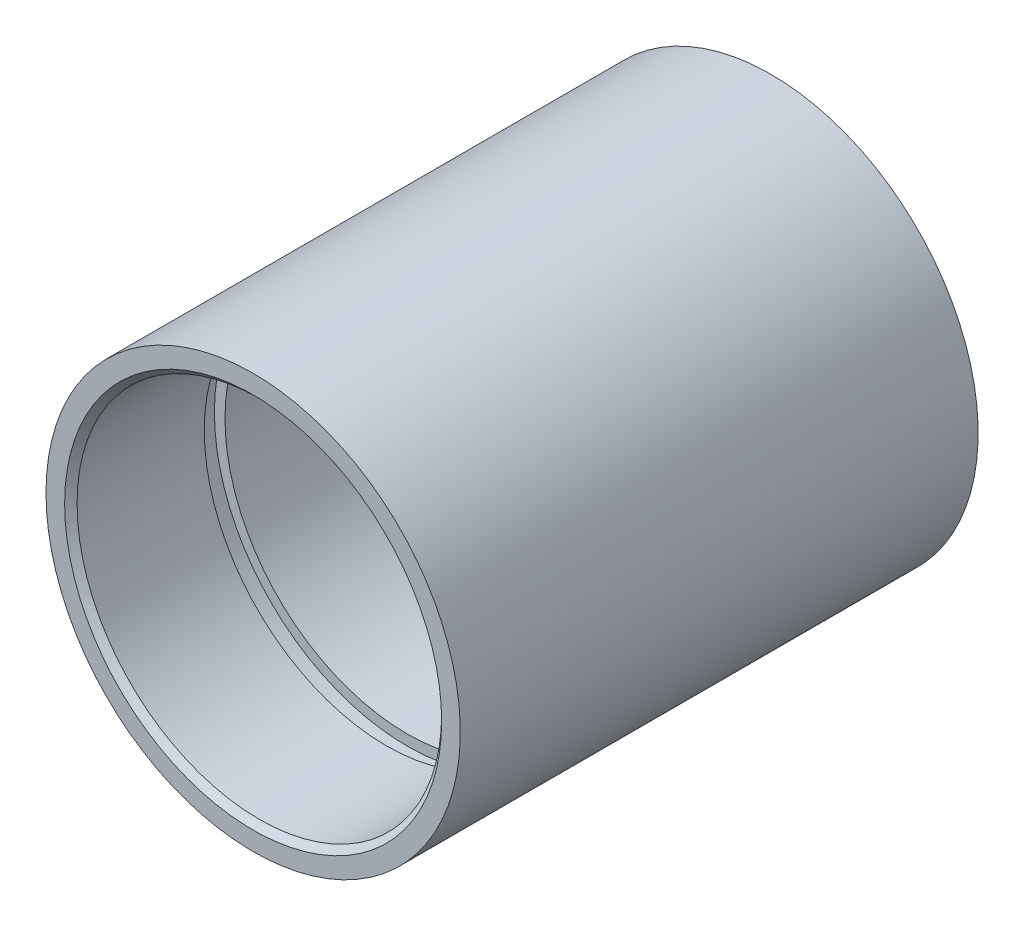
ISO-10303-21;
HEADER;
FILE_DESCRIPTION(('STEP AP214'),'2;1');
FILE_NAME('part.step','',(''),(''),'','','');
FILE_SCHEMA(('AUTOMOTIVE_DESIGN { 1 0 10303 214 1 1 1 1 }'));
ENDSEC;
DATA;
#1=APPLICATION_CONTEXT('core data for automotive mechanical design processes');
#2=APPLICATION_PROTOCOL_DEFINITION('international standard','automotive_design',2000,#1);
#3=PRODUCT_CONTEXT('',#1,'mechanical');
#4=PRODUCT('Part','Part','',(#3));
#5=PRODUCT_RELATED_PRODUCT_CATEGORY('part','',(#4));
#6=PRODUCT_DEFINITION_FORMATION('','',#4);
#7=PRODUCT_DEFINITION_CONTEXT('part definition',#1,'design');
#8=PRODUCT_DEFINITION('design','',#6,#7);
#9=PRODUCT_DEFINITION_SHAPE('','',#8);
#10=(LENGTH_UNIT() NAMED_UNIT(*) SI_UNIT(.MILLI.,.METRE.));
#11=(NAMED_UNIT(*) PLANE_ANGLE_UNIT() SI_UNIT($,.RADIAN.));
#12=(NAMED_UNIT(*) SI_UNIT($,.STERADIAN.) SOLID_ANGLE_UNIT());
#13=UNCERTAINTY_MEASURE_WITH_UNIT(LENGTH_MEASURE(1.E-05),#10,'distance_accuracy_value','');
#14=(GEOMETRIC_REPRESENTATION_CONTEXT(3) GLOBAL_UNCERTAINTY_ASSIGNED_CONTEXT((#13)) GLOBAL_UNIT_ASSIGNED_CONTEXT((#10,
#11,#12)) REPRESENTATION_CONTEXT('',''));
#15=CARTESIAN_POINT('',(0.,0.,0.));
#16=DIRECTION('',(0.,0.,1.));
#17=DIRECTION('',(1.,0.,0.));
#18=AXIS2_PLACEMENT_3D('',#15,#16,#17);
#19=CARTESIAN_POINT('',(0.,0.,22.3012));
#20=DIRECTION('',(0.,0.,1.));
#21=DIRECTION('',(1.,0.,0.));
#22=AXIS2_PLACEMENT_3D('',#19,#20,#21);
#23=PLANE('',#22);
#24=CARTESIAN_POINT('',(0.,0.,22.3012));
#25=DIRECTION('',(0.,0.,1.));
#26=DIRECTION('',(1.,0.,0.));
#27=AXIS2_PLACEMENT_3D('',#24,#25,#26);
#28=CIRCLE('',#27,11.176);
#29=CARTESIAN_POINT('',(11.176,0.,22.3012));
#30=VERTEX_POINT('',#29);
#31=EDGE_CURVE('E28',#30,#30,#28,.T.);
#32=ORIENTED_EDGE('',*,*,#31,.F.);
#33=EDGE_LOOP('',(#32));
#34=FACE_BOUND('',#33,.T.);
#35=CARTESIAN_POINT('',(0.,0.,22.3012));
#36=DIRECTION('',(0.,0.,1.));
#37=DIRECTION('',(1.,0.,0.));
#38=AXIS2_PLACEMENT_3D('',#35,#36,#37);
#39=CIRCLE('',#38,11.8237);
#40=CARTESIAN_POINT('',(-11.8237,0.,22.3012));
#41=VERTEX_POINT('',#40);
#42=EDGE_CURVE('E129',#41,#41,#39,.T.);
#43=ORIENTED_EDGE('',*,*,#42,.T.);
#44=EDGE_LOOP('',(#43));
#45=FACE_BOUND('',#44,.T.);
#46=ADVANCED_FACE('F17',(#34,#45),#23,.T.);
#47=CARTESIAN_POINT('',(0.,0.,23.5712));
#48=DIRECTION('',(0.,0.,1.));
#49=DIRECTION('',(1.,0.,0.));
#50=AXIS2_PLACEMENT_3D('',#47,#48,#49);
#51=PLANE('',#50);
#52=CARTESIAN_POINT('',(0.,0.,23.5712));
#53=DIRECTION('',(0.,0.,1.));
#54=DIRECTION('',(1.,0.,0.));
#55=AXIS2_PLACEMENT_3D('',#52,#53,#54);
#56=CIRCLE('',#55,11.176);
#57=CARTESIAN_POINT('',(-11.176,0.,23.5712));
#58=VERTEX_POINT('',#57);
#59=EDGE_CURVE('E109',#58,#58,#56,.T.);
#60=ORIENTED_EDGE('',*,*,#59,.T.);
#61=EDGE_LOOP('',(#60));
#62=FACE_BOUND('',#61,.T.);
#63=CARTESIAN_POINT('',(0.,0.,23.5712));
#64=DIRECTION('',(0.,0.,1.));
#65=DIRECTION('',(1.,0.,0.));
#66=AXIS2_PLACEMENT_3D('',#63,#64,#65);
#67=CIRCLE('',#66,11.8237);
#68=CARTESIAN_POINT('',(11.8237,0.,23.5712));
#69=VERTEX_POINT('',#68);
#70=EDGE_CURVE('E74',#69,#69,#67,.T.);
#71=ORIENTED_EDGE('',*,*,#70,.F.);
#72=EDGE_LOOP('',(#71));
#73=FACE_BOUND('',#72,.T.);
#74=ADVANCED_FACE('F177',(#62,#73),#51,.F.);
#75=CARTESIAN_POINT('',(0.,0.,9.4488));
#76=DIRECTION('',(0.,0.,1.));
#77=DIRECTION('',(1.,0.,0.));
#78=AXIS2_PLACEMENT_3D('',#75,#76,#77);
#79=PLANE('',#78);
#80=CARTESIAN_POINT('',(0.,0.,9.4488));
#81=DIRECTION('',(0.,0.,1.));
#82=DIRECTION('',(1.,0.,0.));
#83=AXIS2_PLACEMENT_3D('',#80,#81,#82);
#84=CIRCLE('',#83,11.176);
#85=CARTESIAN_POINT('',(-11.176,0.,9.4488));
#86=VERTEX_POINT('',#85);
#87=EDGE_CURVE('E11',#86,#86,#84,.T.);
#88=ORIENTED_EDGE('',*,*,#87,.T.);
#89=EDGE_LOOP('',(#88));
#90=FACE_BOUND('',#89,.T.);
#91=CARTESIAN_POINT('',(0.,0.,9.4488));
#92=DIRECTION('',(0.,0.,1.));
#93=DIRECTION('',(1.,0.,0.));
#94=AXIS2_PLACEMENT_3D('',#91,#92,#93);
#95=CIRCLE('',#94,11.8237);
#96=CARTESIAN_POINT('',(11.8237,0.,9.4488));
#97=VERTEX_POINT('',#96);
#98=EDGE_CURVE('E115',#97,#97,#95,.T.);
#99=ORIENTED_EDGE('',*,*,#98,.F.);
#100=EDGE_LOOP('',(#99));
#101=FACE_BOUND('',#100,.T.);
#102=ADVANCED_FACE('F183',(#90,#101),#79,.F.);
#103=CARTESIAN_POINT('',(0.,0.,8.1788));
#104=DIRECTION('',(0.,0.,1.));
#105=DIRECTION('',(1.,0.,0.));
#106=AXIS2_PLACEMENT_3D('',#103,#104,#105);
#107=PLANE('',#106);
#108=CARTESIAN_POINT('',(0.,0.,8.1788));
#109=DIRECTION('',(0.,0.,1.));
#110=DIRECTION('',(1.,0.,0.));
#111=AXIS2_PLACEMENT_3D('',#108,#109,#110);
#112=CIRCLE('',#111,11.176);
#113=CARTESIAN_POINT('',(11.176,0.,8.1788));
#114=VERTEX_POINT('',#113);
#115=EDGE_CURVE('E84',#114,#114,#112,.T.);
#116=ORIENTED_EDGE('',*,*,#115,.F.);
#117=EDGE_LOOP('',(#116));
#118=FACE_BOUND('',#117,.T.);
#119=CARTESIAN_POINT('',(0.,0.,8.1788));
#120=DIRECTION('',(0.,0.,1.));
#121=DIRECTION('',(1.,0.,0.));
#122=AXIS2_PLACEMENT_3D('',#119,#120,#121);
#123=CIRCLE('',#122,11.8237);
#124=CARTESIAN_POINT('',(11.8237,0.,8.1788));
#125=VERTEX_POINT('',#124);
#126=EDGE_CURVE('E120',#125,#125,#123,.T.);
#127=ORIENTED_EDGE('',*,*,#126,.T.);
#128=EDGE_LOOP('',(#127));
#129=FACE_BOUND('',#128,.T.);
#130=ADVANCED_FACE('F211',(#118,#129),#107,.T.);
#131=CARTESIAN_POINT('',(0.,0.,0.));
#132=DIRECTION('',(0.,0.,1.));
#133=DIRECTION('',(1.,0.,0.));
#134=AXIS2_PLACEMENT_3D('',#131,#132,#133);
#135=PLANE('',#134);
#136=CARTESIAN_POINT('',(0.,0.,0.));
#137=DIRECTION('',(0.,0.,1.));
#138=DIRECTION('',(1.,0.,0.));
#139=AXIS2_PLACEMENT_3D('',#136,#137,#138);
#140=CIRCLE('',#139,11.557);
#141=CARTESIAN_POINT('',(-11.557,0.,0.));
#142=VERTEX_POINT('',#141);
#143=EDGE_CURVE('E133',#142,#142,#140,.T.);
#144=ORIENTED_EDGE('',*,*,#143,.T.);
#145=EDGE_LOOP('',(#144));
#146=FACE_BOUND('',#145,.T.);
#147=CARTESIAN_POINT('',(0.,0.,0.));
#148=DIRECTION('',(0.,0.,1.));
#149=DIRECTION('',(1.,0.,0.));
#150=AXIS2_PLACEMENT_3D('',#147,#148,#149);
#151=CIRCLE('',#150,12.7);
#152=CARTESIAN_POINT('',(-12.7,0.,0.));
#153=VERTEX_POINT('',#152);
#154=EDGE_CURVE('E93',#153,#153,#151,.T.);
#155=ORIENTED_EDGE('',*,*,#154,.F.);
#156=EDGE_LOOP('',(#155));
#157=FACE_BOUND('',#156,.T.);
#158=ADVANCED_FACE('F205',(#146,#157),#135,.F.);
#159=CARTESIAN_POINT('',(0.,0.,31.75));
#160=DIRECTION('',(0.,0.,1.));
#161=DIRECTION('',(1.,0.,0.));
#162=AXIS2_PLACEMENT_3D('',#159,#160,#161);
#163=PLANE('',#162);
#164=CARTESIAN_POINT('',(0.,0.,31.75));
#165=DIRECTION('',(0.,0.,-1.));
#166=DIRECTION('',(1.,0.,0.));
#167=AXIS2_PLACEMENT_3D('',#164,#165,#166);
#168=CIRCLE('',#167,11.557);
#169=CARTESIAN_POINT('',(11.557,0.,31.75));
#170=VERTEX_POINT('',#169);
#171=EDGE_CURVE('E64',#170,#170,#168,.T.);
#172=ORIENTED_EDGE('',*,*,#171,.T.);
#173=EDGE_LOOP('',(#172));
#174=FACE_BOUND('',#173,.T.);
#175=CARTESIAN_POINT('',(0.,0.,31.75));
#176=DIRECTION('',(0.,0.,1.));
#177=DIRECTION('',(1.,0.,0.));
#178=AXIS2_PLACEMENT_3D('',#175,#176,#177);
#179=CIRCLE('',#178,12.7);
#180=CARTESIAN_POINT('',(-12.7,0.,31.75));
#181=VERTEX_POINT('',#180);
#182=EDGE_CURVE('E127',#181,#181,#179,.T.);
#183=ORIENTED_EDGE('',*,*,#182,.T.);
#184=EDGE_LOOP('',(#183));
#185=FACE_BOUND('',#184,.T.);
#186=ADVANCED_FACE('F19',(#174,#185),#163,.T.);
#187=CARTESIAN_POINT('',(0.,0.,31.75));
#188=DIRECTION('',(0.,0.,-1.));
#189=DIRECTION('',(-1.,0.,0.));
#190=AXIS2_PLACEMENT_3D('',#187,#188,#189);
#191=CYLINDRICAL_SURFACE('',#190,11.176);
#192=ORIENTED_EDGE('',*,*,#87,.F.);
#193=EDGE_LOOP('',(#192));
#194=FACE_BOUND('',#193,.T.);
#195=ORIENTED_EDGE('',*,*,#31,.T.);
#196=EDGE_LOOP('',(#195));
#197=FACE_BOUND('',#196,.T.);
#198=ADVANCED_FACE('F191',(#194,#197),#191,.F.);
#199=CARTESIAN_POINT('',(0.,0.,31.75));
#200=DIRECTION('',(0.,0.,-1.));
#201=DIRECTION('',(-1.,0.,0.));
#202=AXIS2_PLACEMENT_3D('',#199,#200,#201);
#203=CYLINDRICAL_SURFACE('',#202,11.176);
#204=CARTESIAN_POINT('',(0.,0.,0.381));
#205=DIRECTION('',(0.,0.,-1.));
#206=DIRECTION('',(1.,0.,0.));
#207=AXIS2_PLACEMENT_3D('',#204,#205,#206);
#208=CIRCLE('',#207,11.176);
#209=CARTESIAN_POINT('',(-11.176,0.,0.381));
#210=VERTEX_POINT('',#209);
#211=EDGE_CURVE('E136',#210,#210,#208,.T.);
#212=ORIENTED_EDGE('',*,*,#211,.T.);
#213=EDGE_LOOP('',(#212));
#214=FACE_BOUND('',#213,.T.);
#215=ORIENTED_EDGE('',*,*,#115,.T.);
#216=EDGE_LOOP('',(#215));
#217=FACE_BOUND('',#216,.T.);
#218=ADVANCED_FACE('F188',(#214,#217),#203,.F.);
#219=CARTESIAN_POINT('',(0.,0.,31.75));
#220=DIRECTION('',(0.,0.,-1.));
#221=DIRECTION('',(-1.,0.,0.));
#222=AXIS2_PLACEMENT_3D('',#219,#220,#221);
#223=CYLINDRICAL_SURFACE('',#222,12.7);
#224=ORIENTED_EDGE('',*,*,#154,.T.);
#225=EDGE_LOOP('',(#224));
#226=FACE_BOUND('',#225,.T.);
#227=ORIENTED_EDGE('',*,*,#182,.F.);
#228=EDGE_LOOP('',(#227));
#229=FACE_BOUND('',#228,.T.);
#230=ADVANCED_FACE('F190',(#226,#229),#223,.T.);
#231=CARTESIAN_POINT('',(0.,0.,31.75));
#232=DIRECTION('',(0.,0.,-1.));
#233=DIRECTION('',(-1.,0.,0.));
#234=AXIS2_PLACEMENT_3D('',#231,#232,#233);
#235=CYLINDRICAL_SURFACE('',#234,11.176);
#236=ORIENTED_EDGE('',*,*,#59,.F.);
#237=EDGE_LOOP('',(#236));
#238=FACE_BOUND('',#237,.T.);
#239=CARTESIAN_POINT('',(0.,0.,31.369));
#240=DIRECTION('',(0.,0.,1.));
#241=DIRECTION('',(1.,0.,0.));
#242=AXIS2_PLACEMENT_3D('',#239,#240,#241);
#243=CIRCLE('',#242,11.176);
#244=CARTESIAN_POINT('',(11.176,0.,31.369));
#245=VERTEX_POINT('',#244);
#246=EDGE_CURVE('E21',#245,#245,#243,.T.);
#247=ORIENTED_EDGE('',*,*,#246,.T.);
#248=EDGE_LOOP('',(#247));
#249=FACE_BOUND('',#248,.T.);
#250=ADVANCED_FACE('F158',(#238,#249),#235,.F.);
#251=CARTESIAN_POINT('',(0.,0.,8.1788));
#252=DIRECTION('',(0.,0.,1.));
#253=DIRECTION('',(1.,0.,0.));
#254=AXIS2_PLACEMENT_3D('',#251,#252,#253);
#255=CYLINDRICAL_SURFACE('',#254,11.8237);
#256=ORIENTED_EDGE('',*,*,#98,.T.);
#257=EDGE_LOOP('',(#256));
#258=FACE_BOUND('',#257,.T.);
#259=ORIENTED_EDGE('',*,*,#126,.F.);
#260=EDGE_LOOP('',(#259));
#261=FACE_BOUND('',#260,.T.);
#262=ADVANCED_FACE('F116',(#258,#261),#255,.F.);
#263=CARTESIAN_POINT('',(0.,0.,23.5712));
#264=DIRECTION('',(0.,0.,-1.));
#265=DIRECTION('',(-1.,0.,0.));
#266=AXIS2_PLACEMENT_3D('',#263,#264,#265);
#267=CYLINDRICAL_SURFACE('',#266,11.8237);
#268=ORIENTED_EDGE('',*,*,#42,.F.);
#269=EDGE_LOOP('',(#268));
#270=FACE_BOUND('',#269,.T.);
#271=ORIENTED_EDGE('',*,*,#70,.T.);
#272=EDGE_LOOP('',(#271));
#273=FACE_BOUND('',#272,.T.);
#274=ADVANCED_FACE('F163',(#270,#273),#267,.F.);
#275=CARTESIAN_POINT('',(0.,0.,31.369));
#276=DIRECTION('',(0.,0.,1.));
#277=DIRECTION('',(1.,0.,0.));
#278=AXIS2_PLACEMENT_3D('',#275,#276,#277);
#279=CONICAL_SURFACE('',#278,11.176,0.785398163397443);
#280=ORIENTED_EDGE('',*,*,#171,.F.);
#281=EDGE_LOOP('',(#280));
#282=FACE_BOUND('',#281,.T.);
#283=ORIENTED_EDGE('',*,*,#246,.F.);
#284=EDGE_LOOP('',(#283));
#285=FACE_BOUND('',#284,.T.);
#286=ADVANCED_FACE('F160',(#282,#285),#279,.F.);
#287=CARTESIAN_POINT('',(0.,0.,0.));
#288=DIRECTION('',(0.,0.,-1.));
#289=DIRECTION('',(-1.,0.,0.));
#290=AXIS2_PLACEMENT_3D('',#287,#288,#289);
#291=CONICAL_SURFACE('',#290,11.557,0.785398163397457);
#292=ORIENTED_EDGE('',*,*,#143,.F.);
#293=EDGE_LOOP('',(#292));
#294=FACE_BOUND('',#293,.T.);
#295=ORIENTED_EDGE('',*,*,#211,.F.);
#296=EDGE_LOOP('',(#295));
#297=FACE_BOUND('',#296,.T.);
#298=ADVANCED_FACE('F162',(#294,#297),#291,.F.);
#299=CLOSED_SHELL('',(#46,#74,#102,#130,#158,#186,#198,#218,#230,#250,#262,#274,#286,#298));
#300=MANIFOLD_SOLID_BREP('B1',#299);
#301=ADVANCED_BREP_SHAPE_REPRESENTATION('',(#18,#300),#14);
#302=SHAPE_DEFINITION_REPRESENTATION(#9,#301);
ENDSEC;
END-ISO-10303-21;
